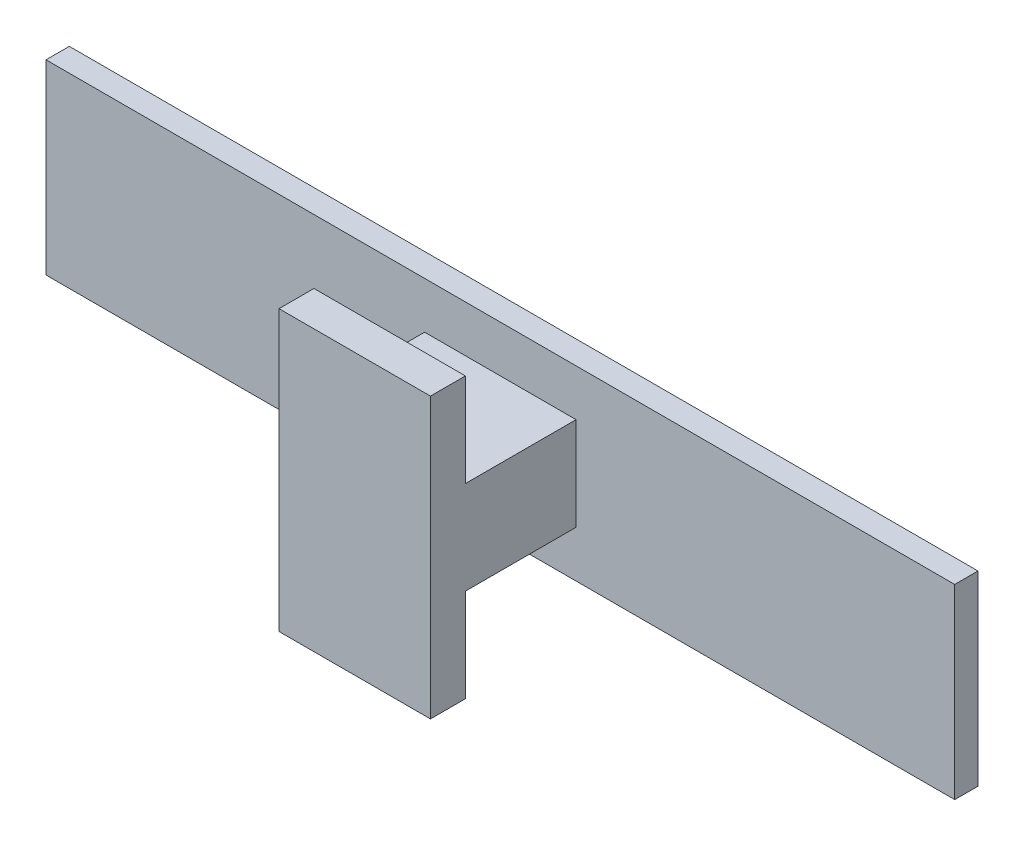
ISO-10303-21;
HEADER;
FILE_DESCRIPTION(('STEP AP214'),'2;1');
FILE_NAME('part.step','',(''),(''),'','','');
FILE_SCHEMA(('AUTOMOTIVE_DESIGN { 1 0 10303 214 1 1 1 1 }'));
ENDSEC;
DATA;
#1=APPLICATION_CONTEXT('core data for automotive mechanical design processes');
#2=APPLICATION_PROTOCOL_DEFINITION('international standard','automotive_design',2000,#1);
#3=PRODUCT_CONTEXT('',#1,'mechanical');
#4=PRODUCT('Part','Part','',(#3));
#5=PRODUCT_RELATED_PRODUCT_CATEGORY('part','',(#4));
#6=PRODUCT_DEFINITION_FORMATION('','',#4);
#7=PRODUCT_DEFINITION_CONTEXT('part definition',#1,'design');
#8=PRODUCT_DEFINITION('design','',#6,#7);
#9=PRODUCT_DEFINITION_SHAPE('','',#8);
#10=(LENGTH_UNIT() NAMED_UNIT(*) SI_UNIT(.MILLI.,.METRE.));
#11=(NAMED_UNIT(*) PLANE_ANGLE_UNIT() SI_UNIT($,.RADIAN.));
#12=(NAMED_UNIT(*) SI_UNIT($,.STERADIAN.) SOLID_ANGLE_UNIT());
#13=UNCERTAINTY_MEASURE_WITH_UNIT(LENGTH_MEASURE(1.E-05),#10,'distance_accuracy_value','');
#14=(GEOMETRIC_REPRESENTATION_CONTEXT(3) GLOBAL_UNCERTAINTY_ASSIGNED_CONTEXT((#13)) GLOBAL_UNIT_ASSIGNED_CONTEXT((#10,
#11,#12)) REPRESENTATION_CONTEXT('',''));
#15=CARTESIAN_POINT('',(0.,0.,0.));
#16=DIRECTION('',(0.,0.,1.));
#17=DIRECTION('',(1.,0.,0.));
#18=AXIS2_PLACEMENT_3D('',#15,#16,#17);
#19=CARTESIAN_POINT('',(-39.,-8.00000000000001,2.));
#20=DIRECTION('',(1.,0.,0.));
#21=DIRECTION('',(0.,0.,-1.));
#22=AXIS2_PLACEMENT_3D('',#19,#20,#21);
#23=PLANE('',#22);
#24=DIRECTION('',(0.,-1.,0.));
#25=VECTOR('',#24,1.);
#26=CARTESIAN_POINT('',(-39.,-8.00000000000001,0.));
#27=LINE('',#26,#25);
#28=CARTESIAN_POINT('',(-39.,7.99999999999999,0.));
#29=VERTEX_POINT('',#28);
#30=CARTESIAN_POINT('',(-39.,-8.00000000000001,0.));
#31=VERTEX_POINT('',#30);
#32=EDGE_CURVE('E199',#29,#31,#27,.T.);
#33=ORIENTED_EDGE('',*,*,#32,.T.);
#34=DIRECTION('',(0.,0.,-1.));
#35=VECTOR('',#34,1.);
#36=CARTESIAN_POINT('',(-39.,-8.00000000000001,2.));
#37=LINE('',#36,#35);
#38=CARTESIAN_POINT('',(-39.,-8.00000000000001,2.));
#39=VERTEX_POINT('',#38);
#40=EDGE_CURVE('E11',#39,#31,#37,.T.);
#41=ORIENTED_EDGE('',*,*,#40,.F.);
#42=DIRECTION('',(0.,-1.,0.));
#43=VECTOR('',#42,1.);
#44=CARTESIAN_POINT('',(-39.,-8.00000000000001,2.));
#45=LINE('',#44,#43);
#46=CARTESIAN_POINT('',(-39.,7.99999999999999,2.));
#47=VERTEX_POINT('',#46);
#48=EDGE_CURVE('E200',#47,#39,#45,.T.);
#49=ORIENTED_EDGE('',*,*,#48,.F.);
#50=DIRECTION('',(0.,0.,-1.));
#51=VECTOR('',#50,1.);
#52=CARTESIAN_POINT('',(-39.,7.99999999999999,2.));
#53=LINE('',#52,#51);
#54=EDGE_CURVE('E214',#47,#29,#53,.T.);
#55=ORIENTED_EDGE('',*,*,#54,.T.);
#56=EDGE_LOOP('',(#33,#41,#49,#55));
#57=FACE_BOUND('',#56,.T.);
#58=ADVANCED_FACE('F42',(#57),#23,.F.);
#59=CARTESIAN_POINT('',(39.,-7.99999999999999,2.));
#60=DIRECTION('',(0.,1.,0.));
#61=DIRECTION('',(-1.,0.,0.));
#62=AXIS2_PLACEMENT_3D('',#59,#60,#61);
#63=PLANE('',#62);
#64=DIRECTION('',(1.,0.,0.));
#65=VECTOR('',#64,1.);
#66=CARTESIAN_POINT('',(39.,-7.99999999999999,0.));
#67=LINE('',#66,#65);
#68=CARTESIAN_POINT('',(39.,-7.99999999999999,0.));
#69=VERTEX_POINT('',#68);
#70=EDGE_CURVE('E218',#31,#69,#67,.T.);
#71=ORIENTED_EDGE('',*,*,#70,.T.);
#72=DIRECTION('',(0.,0.,-1.));
#73=VECTOR('',#72,1.);
#74=CARTESIAN_POINT('',(39.,-7.99999999999999,2.));
#75=LINE('',#74,#73);
#76=CARTESIAN_POINT('',(39.,-7.99999999999999,2.));
#77=VERTEX_POINT('',#76);
#78=EDGE_CURVE('E50',#77,#69,#75,.T.);
#79=ORIENTED_EDGE('',*,*,#78,.F.);
#80=DIRECTION('',(1.,0.,0.));
#81=VECTOR('',#80,1.);
#82=CARTESIAN_POINT('',(39.,-7.99999999999999,2.));
#83=LINE('',#82,#81);
#84=EDGE_CURVE('E204',#39,#77,#83,.T.);
#85=ORIENTED_EDGE('',*,*,#84,.F.);
#86=ORIENTED_EDGE('',*,*,#40,.T.);
#87=EDGE_LOOP('',(#71,#79,#85,#86));
#88=FACE_BOUND('',#87,.T.);
#89=ADVANCED_FACE('F254',(#88),#63,.F.);
#90=CARTESIAN_POINT('',(39.,-7.99999999999999,2.));
#91=DIRECTION('',(-1.,0.,0.));
#92=DIRECTION('',(0.,0.,1.));
#93=AXIS2_PLACEMENT_3D('',#90,#91,#92);
#94=PLANE('',#93);
#95=DIRECTION('',(0.,1.,0.));
#96=VECTOR('',#95,1.);
#97=CARTESIAN_POINT('',(39.,-7.99999999999999,0.));
#98=LINE('',#97,#96);
#99=CARTESIAN_POINT('',(39.,8.00000000000001,0.));
#100=VERTEX_POINT('',#99);
#101=EDGE_CURVE('E221',#69,#100,#98,.T.);
#102=ORIENTED_EDGE('',*,*,#101,.T.);
#103=DIRECTION('',(0.,0.,-1.));
#104=VECTOR('',#103,1.);
#105=CARTESIAN_POINT('',(39.,8.00000000000001,2.));
#106=LINE('',#105,#104);
#107=CARTESIAN_POINT('',(39.,8.00000000000001,2.));
#108=VERTEX_POINT('',#107);
#109=EDGE_CURVE('E229',#108,#100,#106,.T.);
#110=ORIENTED_EDGE('',*,*,#109,.F.);
#111=DIRECTION('',(0.,1.,0.));
#112=VECTOR('',#111,1.);
#113=CARTESIAN_POINT('',(39.,-7.99999999999999,2.));
#114=LINE('',#113,#112);
#115=EDGE_CURVE('E208',#77,#108,#114,.T.);
#116=ORIENTED_EDGE('',*,*,#115,.F.);
#117=ORIENTED_EDGE('',*,*,#78,.T.);
#118=EDGE_LOOP('',(#102,#110,#116,#117));
#119=FACE_BOUND('',#118,.T.);
#120=ADVANCED_FACE('F238',(#119),#94,.F.);
#121=CARTESIAN_POINT('',(39.,8.00000000000001,2.));
#122=DIRECTION('',(0.,-1.,0.));
#123=DIRECTION('',(1.,0.,0.));
#124=AXIS2_PLACEMENT_3D('',#121,#122,#123);
#125=PLANE('',#124);
#126=DIRECTION('',(-1.,0.,0.));
#127=VECTOR('',#126,1.);
#128=CARTESIAN_POINT('',(39.,8.00000000000001,0.));
#129=LINE('',#128,#127);
#130=EDGE_CURVE('E205',#100,#29,#129,.T.);
#131=ORIENTED_EDGE('',*,*,#130,.T.);
#132=ORIENTED_EDGE('',*,*,#54,.F.);
#133=DIRECTION('',(-1.,0.,0.));
#134=VECTOR('',#133,1.);
#135=CARTESIAN_POINT('',(39.,8.00000000000001,2.));
#136=LINE('',#135,#134);
#137=EDGE_CURVE('E211',#108,#47,#136,.T.);
#138=ORIENTED_EDGE('',*,*,#137,.F.);
#139=ORIENTED_EDGE('',*,*,#109,.T.);
#140=EDGE_LOOP('',(#131,#132,#138,#139));
#141=FACE_BOUND('',#140,.T.);
#142=ADVANCED_FACE('F247',(#141),#125,.F.);
#143=CARTESIAN_POINT('',(0.,0.,2.));
#144=DIRECTION('',(0.,0.,1.));
#145=DIRECTION('',(1.,0.,0.));
#146=AXIS2_PLACEMENT_3D('',#143,#144,#145);
#147=PLANE('',#146);
#148=DIRECTION('',(0.,-1.,0.));
#149=VECTOR('',#148,1.);
#150=CARTESIAN_POINT('',(-6.5,-4.,2.));
#151=LINE('',#150,#149);
#152=CARTESIAN_POINT('',(-6.5,4.,2.));
#153=VERTEX_POINT('',#152);
#154=CARTESIAN_POINT('',(-6.5,-4.,2.));
#155=VERTEX_POINT('',#154);
#156=EDGE_CURVE('E57',#153,#155,#151,.T.);
#157=ORIENTED_EDGE('',*,*,#156,.F.);
#158=DIRECTION('',(-1.,0.,0.));
#159=VECTOR('',#158,1.);
#160=CARTESIAN_POINT('',(6.5,4.,2.));
#161=LINE('',#160,#159);
#162=CARTESIAN_POINT('',(6.5,4.,2.));
#163=VERTEX_POINT('',#162);
#164=EDGE_CURVE('E61',#163,#153,#161,.T.);
#165=ORIENTED_EDGE('',*,*,#164,.F.);
#166=DIRECTION('',(0.,1.,0.));
#167=VECTOR('',#166,1.);
#168=CARTESIAN_POINT('',(6.5,-4.,2.));
#169=LINE('',#168,#167);
#170=CARTESIAN_POINT('',(6.5,-4.,2.));
#171=VERTEX_POINT('',#170);
#172=EDGE_CURVE('E179',#171,#163,#169,.T.);
#173=ORIENTED_EDGE('',*,*,#172,.F.);
#174=DIRECTION('',(1.,0.,0.));
#175=VECTOR('',#174,1.);
#176=CARTESIAN_POINT('',(6.5,-4.,2.));
#177=LINE('',#176,#175);
#178=EDGE_CURVE('E161',#155,#171,#177,.T.);
#179=ORIENTED_EDGE('',*,*,#178,.F.);
#180=EDGE_LOOP('',(#157,#165,#173,#179));
#181=FACE_BOUND('',#180,.T.);
#182=ORIENTED_EDGE('',*,*,#48,.T.);
#183=ORIENTED_EDGE('',*,*,#84,.T.);
#184=ORIENTED_EDGE('',*,*,#115,.T.);
#185=ORIENTED_EDGE('',*,*,#137,.T.);
#186=EDGE_LOOP('',(#182,#183,#184,#185));
#187=FACE_BOUND('',#186,.T.);
#188=ADVANCED_FACE('F253',(#181,#187),#147,.T.);
#189=CARTESIAN_POINT('',(0.,0.,0.));
#190=DIRECTION('',(0.,0.,1.));
#191=DIRECTION('',(1.,0.,0.));
#192=AXIS2_PLACEMENT_3D('',#189,#190,#191);
#193=PLANE('',#192);
#194=ORIENTED_EDGE('',*,*,#32,.F.);
#195=ORIENTED_EDGE('',*,*,#130,.F.);
#196=ORIENTED_EDGE('',*,*,#101,.F.);
#197=ORIENTED_EDGE('',*,*,#70,.F.);
#198=EDGE_LOOP('',(#194,#195,#196,#197));
#199=FACE_BOUND('',#198,.T.);
#200=ADVANCED_FACE('F244',(#199),#193,.F.);
#201=CARTESIAN_POINT('',(-6.5,-4.,11.5));
#202=DIRECTION('',(1.,0.,0.));
#203=DIRECTION('',(0.,0.,-1.));
#204=AXIS2_PLACEMENT_3D('',#201,#202,#203);
#205=PLANE('',#204);
#206=ORIENTED_EDGE('',*,*,#156,.T.);
#207=DIRECTION('',(0.,0.,-1.));
#208=VECTOR('',#207,1.);
#209=CARTESIAN_POINT('',(-6.5,-4.,11.5));
#210=LINE('',#209,#208);
#211=CARTESIAN_POINT('',(-6.5,-4.,11.5));
#212=VERTEX_POINT('',#211);
#213=EDGE_CURVE('E195',#212,#155,#210,.T.);
#214=ORIENTED_EDGE('',*,*,#213,.F.);
#215=DIRECTION('',(0.,-1.,0.));
#216=VECTOR('',#215,1.);
#217=CARTESIAN_POINT('',(-6.5,-12.,11.5));
#218=LINE('',#217,#216);
#219=CARTESIAN_POINT('',(-6.5,-12.,11.5));
#220=VERTEX_POINT('',#219);
#221=EDGE_CURVE('E155',#212,#220,#218,.T.);
#222=ORIENTED_EDGE('',*,*,#221,.T.);
#223=DIRECTION('',(0.,0.,-1.));
#224=VECTOR('',#223,1.);
#225=CARTESIAN_POINT('',(-6.5,-12.,14.5));
#226=LINE('',#225,#224);
#227=CARTESIAN_POINT('',(-6.5,-12.,14.5));
#228=VERTEX_POINT('',#227);
#229=EDGE_CURVE('E133',#228,#220,#226,.T.);
#230=ORIENTED_EDGE('',*,*,#229,.F.);
#231=DIRECTION('',(0.,-1.,0.));
#232=VECTOR('',#231,1.);
#233=CARTESIAN_POINT('',(-6.5,-12.,14.5));
#234=LINE('',#233,#232);
#235=CARTESIAN_POINT('',(-6.5,12.,14.5));
#236=VERTEX_POINT('',#235);
#237=EDGE_CURVE('E140',#236,#228,#234,.T.);
#238=ORIENTED_EDGE('',*,*,#237,.F.);
#239=DIRECTION('',(0.,0.,-1.));
#240=VECTOR('',#239,1.);
#241=CARTESIAN_POINT('',(-6.5,12.,14.5));
#242=LINE('',#241,#240);
#243=CARTESIAN_POINT('',(-6.5,12.,11.5));
#244=VERTEX_POINT('',#243);
#245=EDGE_CURVE('E441',#236,#244,#242,.T.);
#246=ORIENTED_EDGE('',*,*,#245,.T.);
#247=CARTESIAN_POINT('',(-6.5,4.,11.5));
#248=VERTEX_POINT('',#247);
#249=EDGE_CURVE('E435',#244,#248,#218,.T.);
#250=ORIENTED_EDGE('',*,*,#249,.T.);
#251=DIRECTION('',(0.,0.,-1.));
#252=VECTOR('',#251,1.);
#253=CARTESIAN_POINT('',(-6.5,4.,11.5));
#254=LINE('',#253,#252);
#255=EDGE_CURVE('E174',#248,#153,#254,.T.);
#256=ORIENTED_EDGE('',*,*,#255,.T.);
#257=EDGE_LOOP('',(#206,#214,#222,#230,#238,#246,#250,#256));
#258=FACE_BOUND('',#257,.T.);
#259=ADVANCED_FACE('F152',(#258),#205,.F.);
#260=CARTESIAN_POINT('',(6.5,-4.,11.5));
#261=DIRECTION('',(0.,1.,0.));
#262=DIRECTION('',(-1.,0.,0.));
#263=AXIS2_PLACEMENT_3D('',#260,#261,#262);
#264=PLANE('',#263);
#265=ORIENTED_EDGE('',*,*,#178,.T.);
#266=DIRECTION('',(0.,0.,-1.));
#267=VECTOR('',#266,1.);
#268=CARTESIAN_POINT('',(6.5,-4.,11.5));
#269=LINE('',#268,#267);
#270=CARTESIAN_POINT('',(6.5,-4.,11.5));
#271=VERTEX_POINT('',#270);
#272=EDGE_CURVE('E191',#271,#171,#269,.T.);
#273=ORIENTED_EDGE('',*,*,#272,.F.);
#274=DIRECTION('',(1.,0.,0.));
#275=VECTOR('',#274,1.);
#276=CARTESIAN_POINT('',(6.5,-4.,11.5));
#277=LINE('',#276,#275);
#278=EDGE_CURVE('E167',#212,#271,#277,.T.);
#279=ORIENTED_EDGE('',*,*,#278,.F.);
#280=ORIENTED_EDGE('',*,*,#213,.T.);
#281=EDGE_LOOP('',(#265,#273,#279,#280));
#282=FACE_BOUND('',#281,.T.);
#283=ADVANCED_FACE('F270',(#282),#264,.F.);
#284=CARTESIAN_POINT('',(6.5,-4.,11.5));
#285=DIRECTION('',(-1.,0.,0.));
#286=DIRECTION('',(0.,0.,1.));
#287=AXIS2_PLACEMENT_3D('',#284,#285,#286);
#288=PLANE('',#287);
#289=ORIENTED_EDGE('',*,*,#172,.T.);
#290=DIRECTION('',(0.,0.,-1.));
#291=VECTOR('',#290,1.);
#292=CARTESIAN_POINT('',(6.5,4.,11.5));
#293=LINE('',#292,#291);
#294=CARTESIAN_POINT('',(6.5,4.,11.5));
#295=VERTEX_POINT('',#294);
#296=EDGE_CURVE('E187',#295,#163,#293,.T.);
#297=ORIENTED_EDGE('',*,*,#296,.F.);
#298=DIRECTION('',(0.,1.,0.));
#299=VECTOR('',#298,1.);
#300=CARTESIAN_POINT('',(6.5,-12.,11.5));
#301=LINE('',#300,#299);
#302=CARTESIAN_POINT('',(6.5,12.,11.5));
#303=VERTEX_POINT('',#302);
#304=EDGE_CURVE('E422',#295,#303,#301,.T.);
#305=ORIENTED_EDGE('',*,*,#304,.T.);
#306=DIRECTION('',(0.,0.,-1.));
#307=VECTOR('',#306,1.);
#308=CARTESIAN_POINT('',(6.5,12.,14.5));
#309=LINE('',#308,#307);
#310=CARTESIAN_POINT('',(6.5,12.,14.5));
#311=VERTEX_POINT('',#310);
#312=EDGE_CURVE('E163',#311,#303,#309,.T.);
#313=ORIENTED_EDGE('',*,*,#312,.F.);
#314=DIRECTION('',(0.,1.,0.));
#315=VECTOR('',#314,1.);
#316=CARTESIAN_POINT('',(6.5,-12.,14.5));
#317=LINE('',#316,#315);
#318=CARTESIAN_POINT('',(6.5,-12.,14.5));
#319=VERTEX_POINT('',#318);
#320=EDGE_CURVE('E139',#319,#311,#317,.T.);
#321=ORIENTED_EDGE('',*,*,#320,.F.);
#322=DIRECTION('',(0.,0.,-1.));
#323=VECTOR('',#322,1.);
#324=CARTESIAN_POINT('',(6.5,-12.,14.5));
#325=LINE('',#324,#323);
#326=CARTESIAN_POINT('',(6.5,-12.,11.5));
#327=VERTEX_POINT('',#326);
#328=EDGE_CURVE('E135',#319,#327,#325,.T.);
#329=ORIENTED_EDGE('',*,*,#328,.T.);
#330=EDGE_CURVE('E429',#327,#271,#301,.T.);
#331=ORIENTED_EDGE('',*,*,#330,.T.);
#332=ORIENTED_EDGE('',*,*,#272,.T.);
#333=EDGE_LOOP('',(#289,#297,#305,#313,#321,#329,#331,#332));
#334=FACE_BOUND('',#333,.T.);
#335=ADVANCED_FACE('F273',(#334),#288,.F.);
#336=CARTESIAN_POINT('',(6.5,4.,11.5));
#337=DIRECTION('',(0.,-1.,0.));
#338=DIRECTION('',(1.,0.,0.));
#339=AXIS2_PLACEMENT_3D('',#336,#337,#338);
#340=PLANE('',#339);
#341=ORIENTED_EDGE('',*,*,#164,.T.);
#342=ORIENTED_EDGE('',*,*,#255,.F.);
#343=DIRECTION('',(-1.,0.,0.));
#344=VECTOR('',#343,1.);
#345=CARTESIAN_POINT('',(6.5,4.,11.5));
#346=LINE('',#345,#344);
#347=EDGE_CURVE('E171',#295,#248,#346,.T.);
#348=ORIENTED_EDGE('',*,*,#347,.F.);
#349=ORIENTED_EDGE('',*,*,#296,.T.);
#350=EDGE_LOOP('',(#341,#342,#348,#349));
#351=FACE_BOUND('',#350,.T.);
#352=ADVANCED_FACE('F277',(#351),#340,.F.);
#353=CARTESIAN_POINT('',(0.,0.,11.5));
#354=DIRECTION('',(0.,0.,1.));
#355=DIRECTION('',(1.,0.,0.));
#356=AXIS2_PLACEMENT_3D('',#353,#354,#355);
#357=PLANE('',#356);
#358=ORIENTED_EDGE('',*,*,#221,.F.);
#359=ORIENTED_EDGE('',*,*,#278,.T.);
#360=ORIENTED_EDGE('',*,*,#330,.F.);
#361=DIRECTION('',(1.,0.,0.));
#362=VECTOR('',#361,1.);
#363=CARTESIAN_POINT('',(6.5,-12.,11.5));
#364=LINE('',#363,#362);
#365=EDGE_CURVE('E430',#220,#327,#364,.T.);
#366=ORIENTED_EDGE('',*,*,#365,.F.);
#367=EDGE_LOOP('',(#358,#359,#360,#366));
#368=FACE_BOUND('',#367,.T.);
#369=ADVANCED_FACE('F281',(#368),#357,.F.);
#370=ORIENTED_EDGE('',*,*,#304,.F.);
#371=ORIENTED_EDGE('',*,*,#347,.T.);
#372=ORIENTED_EDGE('',*,*,#249,.F.);
#373=DIRECTION('',(-1.,0.,0.));
#374=VECTOR('',#373,1.);
#375=CARTESIAN_POINT('',(6.5,12.,11.5));
#376=LINE('',#375,#374);
#377=EDGE_CURVE('E150',#303,#244,#376,.T.);
#378=ORIENTED_EDGE('',*,*,#377,.F.);
#379=EDGE_LOOP('',(#370,#371,#372,#378));
#380=FACE_BOUND('',#379,.T.);
#381=ADVANCED_FACE('F286',(#380),#357,.F.);
#382=CARTESIAN_POINT('',(6.5,-12.,14.5));
#383=DIRECTION('',(0.,1.,0.));
#384=DIRECTION('',(-1.,0.,0.));
#385=AXIS2_PLACEMENT_3D('',#382,#383,#384);
#386=PLANE('',#385);
#387=ORIENTED_EDGE('',*,*,#365,.T.);
#388=ORIENTED_EDGE('',*,*,#328,.F.);
#389=DIRECTION('',(1.,0.,0.));
#390=VECTOR('',#389,1.);
#391=CARTESIAN_POINT('',(6.5,-12.,14.5));
#392=LINE('',#391,#390);
#393=EDGE_CURVE('E129',#228,#319,#392,.T.);
#394=ORIENTED_EDGE('',*,*,#393,.F.);
#395=ORIENTED_EDGE('',*,*,#229,.T.);
#396=EDGE_LOOP('',(#387,#388,#394,#395));
#397=FACE_BOUND('',#396,.T.);
#398=ADVANCED_FACE('F131',(#397),#386,.F.);
#399=CARTESIAN_POINT('',(6.5,12.,14.5));
#400=DIRECTION('',(0.,-1.,0.));
#401=DIRECTION('',(0.,0.,-1.));
#402=AXIS2_PLACEMENT_3D('',#399,#400,#401);
#403=PLANE('',#402);
#404=ORIENTED_EDGE('',*,*,#377,.T.);
#405=ORIENTED_EDGE('',*,*,#245,.F.);
#406=DIRECTION('',(-1.,0.,0.));
#407=VECTOR('',#406,1.);
#408=CARTESIAN_POINT('',(6.5,12.,14.5));
#409=LINE('',#408,#407);
#410=EDGE_CURVE('E145',#311,#236,#409,.T.);
#411=ORIENTED_EDGE('',*,*,#410,.F.);
#412=ORIENTED_EDGE('',*,*,#312,.T.);
#413=EDGE_LOOP('',(#404,#405,#411,#412));
#414=FACE_BOUND('',#413,.T.);
#415=ADVANCED_FACE('F285',(#414),#403,.F.);
#416=CARTESIAN_POINT('',(0.,0.,14.5));
#417=DIRECTION('',(0.,0.,1.));
#418=DIRECTION('',(1.,0.,0.));
#419=AXIS2_PLACEMENT_3D('',#416,#417,#418);
#420=PLANE('',#419);
#421=ORIENTED_EDGE('',*,*,#237,.T.);
#422=ORIENTED_EDGE('',*,*,#393,.T.);
#423=ORIENTED_EDGE('',*,*,#320,.T.);
#424=ORIENTED_EDGE('',*,*,#410,.T.);
#425=EDGE_LOOP('',(#421,#422,#423,#424));
#426=FACE_BOUND('',#425,.T.);
#427=ADVANCED_FACE('F143',(#426),#420,.T.);
#428=CLOSED_SHELL('',(#58,#89,#120,#142,#188,#200,#259,#283,#335,#352,#369,#381,#398,#415,#427));
#429=MANIFOLD_SOLID_BREP('B2',#428);
#430=ADVANCED_BREP_SHAPE_REPRESENTATION('',(#18,#429),#14);
#431=SHAPE_DEFINITION_REPRESENTATION(#9,#430);
ENDSEC;
END-ISO-10303-21;
